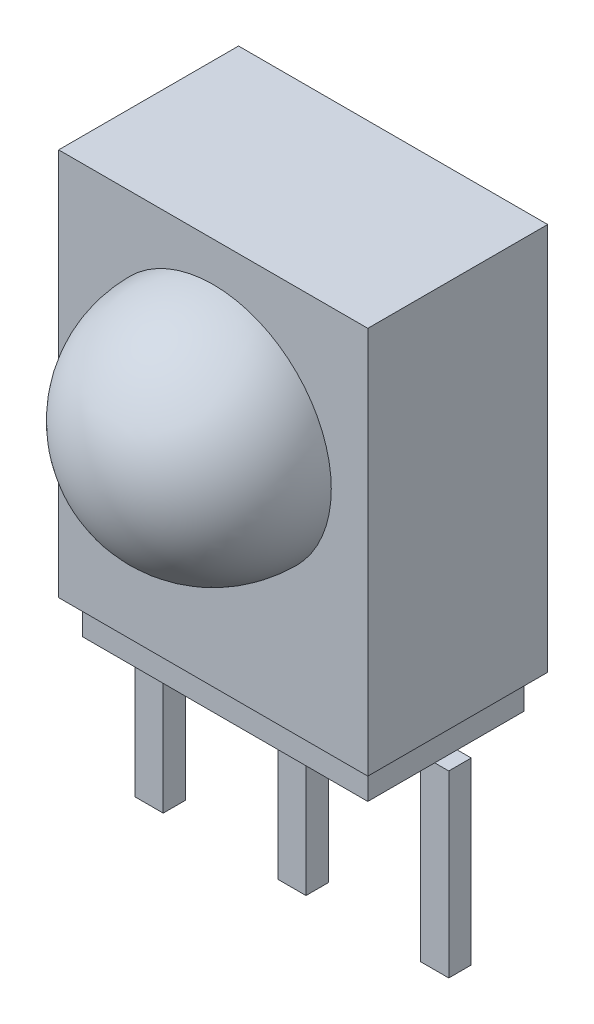
ISO-10303-21;
HEADER;
FILE_DESCRIPTION(('STEP AP214'),'2;1');
FILE_NAME('part.step','',(''),(''),'','','');
FILE_SCHEMA(('AUTOMOTIVE_DESIGN { 1 0 10303 214 1 1 1 1 }'));
ENDSEC;
DATA;
#1=APPLICATION_CONTEXT('core data for automotive mechanical design processes');
#2=APPLICATION_PROTOCOL_DEFINITION('international standard','automotive_design',2000,#1);
#3=PRODUCT_CONTEXT('',#1,'mechanical');
#4=PRODUCT('Part','Part','',(#3));
#5=PRODUCT_RELATED_PRODUCT_CATEGORY('part','',(#4));
#6=PRODUCT_DEFINITION_FORMATION('','',#4);
#7=PRODUCT_DEFINITION_CONTEXT('part definition',#1,'design');
#8=PRODUCT_DEFINITION('design','',#6,#7);
#9=PRODUCT_DEFINITION_SHAPE('','',#8);
#10=(LENGTH_UNIT() NAMED_UNIT(*) SI_UNIT(.MILLI.,.METRE.));
#11=(NAMED_UNIT(*) PLANE_ANGLE_UNIT() SI_UNIT($,.RADIAN.));
#12=(NAMED_UNIT(*) SI_UNIT($,.STERADIAN.) SOLID_ANGLE_UNIT());
#13=UNCERTAINTY_MEASURE_WITH_UNIT(LENGTH_MEASURE(1.E-05),#10,'distance_accuracy_value','');
#14=(GEOMETRIC_REPRESENTATION_CONTEXT(3) GLOBAL_UNCERTAINTY_ASSIGNED_CONTEXT((#13)) GLOBAL_UNIT_ASSIGNED_CONTEXT((#10,
#11,#12)) REPRESENTATION_CONTEXT('',''));
#15=CARTESIAN_POINT('',(0.,0.,0.));
#16=DIRECTION('',(0.,0.,1.));
#17=DIRECTION('',(1.,0.,0.));
#18=AXIS2_PLACEMENT_3D('',#15,#16,#17);
#19=CARTESIAN_POINT('',(0.21,-0.6,0.21));
#20=DIRECTION('',(0.,-1.,0.));
#21=DIRECTION('',(0.,0.,-1.));
#22=AXIS2_PLACEMENT_3D('',#19,#20,#21);
#23=PLANE('',#22);
#24=DIRECTION('',(1.,0.,0.));
#25=VECTOR('',#24,1.);
#26=CARTESIAN_POINT('',(3.,-0.6,1.4));
#27=LINE('',#26,#25);
#28=CARTESIAN_POINT('',(2.5,-0.6,1.4));
#29=VERTEX_POINT('',#28);
#30=CARTESIAN_POINT('',(3.,-0.6,1.4));
#31=VERTEX_POINT('',#30);
#32=EDGE_CURVE('E261',#29,#31,#27,.T.);
#33=ORIENTED_EDGE('',*,*,#32,.F.);
#34=DIRECTION('',(0.,0.,-1.));
#35=VECTOR('',#34,1.);
#36=CARTESIAN_POINT('',(2.5,-0.6,1.8));
#37=LINE('',#36,#35);
#38=CARTESIAN_POINT('',(2.5,-0.6,1.8));
#39=VERTEX_POINT('',#38);
#40=EDGE_CURVE('E247',#39,#29,#37,.T.);
#41=ORIENTED_EDGE('',*,*,#40,.F.);
#42=DIRECTION('',(-1.,0.,0.));
#43=VECTOR('',#42,1.);
#44=CARTESIAN_POINT('',(3.,-0.6,1.8));
#45=LINE('',#44,#43);
#46=CARTESIAN_POINT('',(3.,-0.6,1.8));
#47=VERTEX_POINT('',#46);
#48=EDGE_CURVE('E252',#47,#39,#45,.T.);
#49=ORIENTED_EDGE('',*,*,#48,.F.);
#50=DIRECTION('',(0.,0.,1.));
#51=VECTOR('',#50,1.);
#52=CARTESIAN_POINT('',(3.,-0.6,1.8));
#53=LINE('',#52,#51);
#54=EDGE_CURVE('E263',#31,#47,#53,.T.);
#55=ORIENTED_EDGE('',*,*,#54,.F.);
#56=EDGE_LOOP('',(#33,#41,#49,#55));
#57=FACE_BOUND('',#56,.T.);
#58=DIRECTION('',(0.,0.,1.));
#59=VECTOR('',#58,1.);
#60=CARTESIAN_POINT('',(0.459999999999999,-0.6,1.8));
#61=LINE('',#60,#59);
#62=CARTESIAN_POINT('',(0.459999999999999,-0.6,1.4));
#63=VERTEX_POINT('',#62);
#64=CARTESIAN_POINT('',(0.459999999999999,-0.6,1.8));
#65=VERTEX_POINT('',#64);
#66=EDGE_CURVE('E49',#63,#65,#61,.T.);
#67=ORIENTED_EDGE('',*,*,#66,.F.);
#68=DIRECTION('',(1.,0.,0.));
#69=VECTOR('',#68,1.);
#70=CARTESIAN_POINT('',(0.459999999999999,-0.6,1.4));
#71=LINE('',#70,#69);
#72=CARTESIAN_POINT('',(0.21,-0.6,1.4));
#73=VERTEX_POINT('',#72);
#74=EDGE_CURVE('E655',#73,#63,#71,.T.);
#75=ORIENTED_EDGE('',*,*,#74,.F.);
#76=DIRECTION('',(0.,0.,-1.));
#77=VECTOR('',#76,1.);
#78=CARTESIAN_POINT('',(0.21,-0.6,2.99));
#79=LINE('',#78,#77);
#80=CARTESIAN_POINT('',(0.21,-0.6,0.21));
#81=VERTEX_POINT('',#80);
#82=EDGE_CURVE('E281',#73,#81,#79,.T.);
#83=ORIENTED_EDGE('',*,*,#82,.T.);
#84=DIRECTION('',(1.,0.,0.));
#85=VECTOR('',#84,1.);
#86=CARTESIAN_POINT('',(0.21,-0.6,0.21));
#87=LINE('',#86,#85);
#88=CARTESIAN_POINT('',(5.29,-0.6,0.21));
#89=VERTEX_POINT('',#88);
#90=EDGE_CURVE('E279',#81,#89,#87,.T.);
#91=ORIENTED_EDGE('',*,*,#90,.T.);
#92=DIRECTION('',(0.,0.,1.));
#93=VECTOR('',#92,1.);
#94=CARTESIAN_POINT('',(5.29,-0.6,2.99));
#95=LINE('',#94,#93);
#96=CARTESIAN_POINT('',(5.29,-0.6,1.4));
#97=VERTEX_POINT('',#96);
#98=EDGE_CURVE('E284',#89,#97,#95,.T.);
#99=ORIENTED_EDGE('',*,*,#98,.T.);
#100=DIRECTION('',(1.,0.,0.));
#101=VECTOR('',#100,1.);
#102=CARTESIAN_POINT('',(5.54,-0.6,1.4));
#103=LINE('',#102,#101);
#104=CARTESIAN_POINT('',(5.04,-0.6,1.4));
#105=VERTEX_POINT('',#104);
#106=EDGE_CURVE('E228',#105,#97,#103,.T.);
#107=ORIENTED_EDGE('',*,*,#106,.F.);
#108=DIRECTION('',(0.,0.,-1.));
#109=VECTOR('',#108,1.);
#110=CARTESIAN_POINT('',(5.04,-0.6,1.8));
#111=LINE('',#110,#109);
#112=CARTESIAN_POINT('',(5.04,-0.6,1.8));
#113=VERTEX_POINT('',#112);
#114=EDGE_CURVE('E208',#113,#105,#111,.T.);
#115=ORIENTED_EDGE('',*,*,#114,.F.);
#116=DIRECTION('',(-1.,0.,0.));
#117=VECTOR('',#116,1.);
#118=CARTESIAN_POINT('',(5.54,-0.6,1.8));
#119=LINE('',#118,#117);
#120=CARTESIAN_POINT('',(5.29,-0.6,1.8));
#121=VERTEX_POINT('',#120);
#122=EDGE_CURVE('E233',#121,#113,#119,.T.);
#123=ORIENTED_EDGE('',*,*,#122,.F.);
#124=CARTESIAN_POINT('',(5.29,-0.6,2.99));
#125=VERTEX_POINT('',#124);
#126=EDGE_CURVE('E283',#121,#125,#95,.T.);
#127=ORIENTED_EDGE('',*,*,#126,.T.);
#128=DIRECTION('',(-1.,0.,0.));
#129=VECTOR('',#128,1.);
#130=CARTESIAN_POINT('',(0.21,-0.6,2.99));
#131=LINE('',#130,#129);
#132=CARTESIAN_POINT('',(0.21,-0.6,2.99));
#133=VERTEX_POINT('',#132);
#134=EDGE_CURVE('E287',#125,#133,#131,.T.);
#135=ORIENTED_EDGE('',*,*,#134,.T.);
#136=CARTESIAN_POINT('',(0.21,-0.6,1.8));
#137=VERTEX_POINT('',#136);
#138=EDGE_CURVE('E277',#133,#137,#79,.T.);
#139=ORIENTED_EDGE('',*,*,#138,.T.);
#140=DIRECTION('',(-1.,0.,0.));
#141=VECTOR('',#140,1.);
#142=CARTESIAN_POINT('',(0.459999999999999,-0.6,1.8));
#143=LINE('',#142,#141);
#144=EDGE_CURVE('E54',#65,#137,#143,.T.);
#145=ORIENTED_EDGE('',*,*,#144,.F.);
#146=EDGE_LOOP('',(#67,#75,#83,#91,#99,#107,#115,#123,#127,#135,#139,#145));
#147=FACE_BOUND('',#146,.T.);
#148=ADVANCED_FACE('F34',(#57,#147),#23,.T.);
#149=CARTESIAN_POINT('',(0.,0.,3.2));
#150=DIRECTION('',(0.,1.,0.));
#151=DIRECTION('',(0.,0.,1.));
#152=AXIS2_PLACEMENT_3D('',#149,#150,#151);
#153=PLANE('',#152);
#154=DIRECTION('',(1.,0.,0.));
#155=VECTOR('',#154,1.);
#156=CARTESIAN_POINT('',(0.,0.,0.));
#157=LINE('',#156,#155);
#158=CARTESIAN_POINT('',(0.,0.,0.));
#159=VERTEX_POINT('',#158);
#160=CARTESIAN_POINT('',(5.5,0.,0.));
#161=VERTEX_POINT('',#160);
#162=EDGE_CURVE('E327',#159,#161,#157,.T.);
#163=ORIENTED_EDGE('',*,*,#162,.T.);
#164=DIRECTION('',(0.,0.,-1.));
#165=VECTOR('',#164,1.);
#166=CARTESIAN_POINT('',(5.5,0.,3.2));
#167=LINE('',#166,#165);
#168=CARTESIAN_POINT('',(5.5,0.,3.2));
#169=VERTEX_POINT('',#168);
#170=EDGE_CURVE('E337',#169,#161,#167,.T.);
#171=ORIENTED_EDGE('',*,*,#170,.F.);
#172=DIRECTION('',(1.,0.,0.));
#173=VECTOR('',#172,1.);
#174=CARTESIAN_POINT('',(0.,0.,3.2));
#175=LINE('',#174,#173);
#176=CARTESIAN_POINT('',(0.,0.,3.2));
#177=VERTEX_POINT('',#176);
#178=EDGE_CURVE('E317',#177,#169,#175,.T.);
#179=ORIENTED_EDGE('',*,*,#178,.F.);
#180=DIRECTION('',(0.,0.,-1.));
#181=VECTOR('',#180,1.);
#182=CARTESIAN_POINT('',(0.,0.,3.2));
#183=LINE('',#182,#181);
#184=EDGE_CURVE('E42',#177,#159,#183,.T.);
#185=ORIENTED_EDGE('',*,*,#184,.T.);
#186=EDGE_LOOP('',(#163,#171,#179,#185));
#187=FACE_BOUND('',#186,.T.);
#188=DIRECTION('',(0.,0.,-1.));
#189=VECTOR('',#188,1.);
#190=CARTESIAN_POINT('',(0.21,0.,2.99));
#191=LINE('',#190,#189);
#192=CARTESIAN_POINT('',(0.21,0.,2.99));
#193=VERTEX_POINT('',#192);
#194=CARTESIAN_POINT('',(0.21,0.,0.21));
#195=VERTEX_POINT('',#194);
#196=EDGE_CURVE('E276',#193,#195,#191,.T.);
#197=ORIENTED_EDGE('',*,*,#196,.F.);
#198=DIRECTION('',(-1.,0.,0.));
#199=VECTOR('',#198,1.);
#200=CARTESIAN_POINT('',(0.21,0.,2.99));
#201=LINE('',#200,#199);
#202=CARTESIAN_POINT('',(5.29,0.,2.99));
#203=VERTEX_POINT('',#202);
#204=EDGE_CURVE('E299',#203,#193,#201,.T.);
#205=ORIENTED_EDGE('',*,*,#204,.F.);
#206=DIRECTION('',(0.,0.,1.));
#207=VECTOR('',#206,1.);
#208=CARTESIAN_POINT('',(5.29,0.,2.99));
#209=LINE('',#208,#207);
#210=CARTESIAN_POINT('',(5.29,0.,0.21));
#211=VERTEX_POINT('',#210);
#212=EDGE_CURVE('E296',#211,#203,#209,.T.);
#213=ORIENTED_EDGE('',*,*,#212,.F.);
#214=DIRECTION('',(1.,0.,0.));
#215=VECTOR('',#214,1.);
#216=CARTESIAN_POINT('',(0.21,0.,0.21));
#217=LINE('',#216,#215);
#218=EDGE_CURVE('E293',#195,#211,#217,.T.);
#219=ORIENTED_EDGE('',*,*,#218,.F.);
#220=EDGE_LOOP('',(#197,#205,#213,#219));
#221=FACE_BOUND('',#220,.T.);
#222=ADVANCED_FACE('F342',(#187,#221),#153,.F.);
#223=CARTESIAN_POINT('',(0.,6.9,3.2));
#224=DIRECTION('',(0.,0.,-1.));
#225=DIRECTION('',(-1.,0.,0.));
#226=AXIS2_PLACEMENT_3D('',#223,#224,#225);
#227=PLANE('',#226);
#228=DIRECTION('',(0.,-1.,0.));
#229=VECTOR('',#228,1.);
#230=CARTESIAN_POINT('',(0.,0.,3.2));
#231=LINE('',#230,#229);
#232=CARTESIAN_POINT('',(0.,6.9,3.2));
#233=VERTEX_POINT('',#232);
#234=EDGE_CURVE('E314',#233,#177,#231,.T.);
#235=ORIENTED_EDGE('',*,*,#234,.T.);
#236=ORIENTED_EDGE('',*,*,#178,.T.);
#237=DIRECTION('',(0.,1.,0.));
#238=VECTOR('',#237,1.);
#239=CARTESIAN_POINT('',(5.5,0.,3.2));
#240=LINE('',#239,#238);
#241=CARTESIAN_POINT('',(5.5,6.9,3.2));
#242=VERTEX_POINT('',#241);
#243=EDGE_CURVE('E320',#169,#242,#240,.T.);
#244=ORIENTED_EDGE('',*,*,#243,.T.);
#245=DIRECTION('',(-1.,0.,0.));
#246=VECTOR('',#245,1.);
#247=CARTESIAN_POINT('',(0.,6.9,3.2));
#248=LINE('',#247,#246);
#249=EDGE_CURVE('E322',#242,#233,#248,.T.);
#250=ORIENTED_EDGE('',*,*,#249,.T.);
#251=EDGE_LOOP('',(#235,#236,#244,#250));
#252=FACE_BOUND('',#251,.T.);
#253=CARTESIAN_POINT('',(2.75,4.1,3.2));
#254=DIRECTION('',(0.,0.,-1.));
#255=DIRECTION('',(-1.,0.,0.));
#256=AXIS2_PLACEMENT_3D('',#253,#254,#255);
#257=CIRCLE('',#256,2.1);
#258=CARTESIAN_POINT('',(0.65,4.1,3.2));
#259=VERTEX_POINT('',#258);
#260=EDGE_CURVE('E11',#259,#259,#257,.F.);
#261=ORIENTED_EDGE('',*,*,#260,.F.);
#262=EDGE_LOOP('',(#261));
#263=FACE_BOUND('',#262,.T.);
#264=ADVANCED_FACE('F362',(#252,#263),#227,.F.);
#265=CARTESIAN_POINT('',(0.,0.,3.2));
#266=DIRECTION('',(1.,0.,0.));
#267=DIRECTION('',(0.,0.,-1.));
#268=AXIS2_PLACEMENT_3D('',#265,#266,#267);
#269=PLANE('',#268);
#270=DIRECTION('',(0.,-1.,0.));
#271=VECTOR('',#270,1.);
#272=CARTESIAN_POINT('',(0.,0.,0.));
#273=LINE('',#272,#271);
#274=CARTESIAN_POINT('',(0.,6.9,0.));
#275=VERTEX_POINT('',#274);
#276=EDGE_CURVE('E313',#275,#159,#273,.T.);
#277=ORIENTED_EDGE('',*,*,#276,.T.);
#278=ORIENTED_EDGE('',*,*,#184,.F.);
#279=ORIENTED_EDGE('',*,*,#234,.F.);
#280=DIRECTION('',(0.,0.,-1.));
#281=VECTOR('',#280,1.);
#282=CARTESIAN_POINT('',(0.,6.9,3.2));
#283=LINE('',#282,#281);
#284=EDGE_CURVE('E324',#233,#275,#283,.T.);
#285=ORIENTED_EDGE('',*,*,#284,.T.);
#286=EDGE_LOOP('',(#277,#278,#279,#285));
#287=FACE_BOUND('',#286,.T.);
#288=ADVANCED_FACE('F348',(#287),#269,.F.);
#289=CARTESIAN_POINT('',(5.5,0.,3.2));
#290=DIRECTION('',(-1.,0.,0.));
#291=DIRECTION('',(0.,-1.,0.));
#292=AXIS2_PLACEMENT_3D('',#289,#290,#291);
#293=PLANE('',#292);
#294=DIRECTION('',(0.,1.,0.));
#295=VECTOR('',#294,1.);
#296=CARTESIAN_POINT('',(5.5,0.,0.));
#297=LINE('',#296,#295);
#298=CARTESIAN_POINT('',(5.5,6.9,0.));
#299=VERTEX_POINT('',#298);
#300=EDGE_CURVE('E329',#161,#299,#297,.T.);
#301=ORIENTED_EDGE('',*,*,#300,.T.);
#302=DIRECTION('',(0.,0.,-1.));
#303=VECTOR('',#302,1.);
#304=CARTESIAN_POINT('',(5.5,6.9,3.2));
#305=LINE('',#304,#303);
#306=EDGE_CURVE('E334',#242,#299,#305,.T.);
#307=ORIENTED_EDGE('',*,*,#306,.F.);
#308=ORIENTED_EDGE('',*,*,#243,.F.);
#309=ORIENTED_EDGE('',*,*,#170,.T.);
#310=EDGE_LOOP('',(#301,#307,#308,#309));
#311=FACE_BOUND('',#310,.T.);
#312=ADVANCED_FACE('F356',(#311),#293,.F.);
#313=CARTESIAN_POINT('',(0.,6.9,3.2));
#314=DIRECTION('',(0.,-1.,0.));
#315=DIRECTION('',(0.,0.,-1.));
#316=AXIS2_PLACEMENT_3D('',#313,#314,#315);
#317=PLANE('',#316);
#318=DIRECTION('',(-1.,0.,0.));
#319=VECTOR('',#318,1.);
#320=CARTESIAN_POINT('',(0.,6.9,0.));
#321=LINE('',#320,#319);
#322=EDGE_CURVE('E318',#299,#275,#321,.T.);
#323=ORIENTED_EDGE('',*,*,#322,.T.);
#324=ORIENTED_EDGE('',*,*,#284,.F.);
#325=ORIENTED_EDGE('',*,*,#249,.F.);
#326=ORIENTED_EDGE('',*,*,#306,.T.);
#327=EDGE_LOOP('',(#323,#324,#325,#326));
#328=FACE_BOUND('',#327,.T.);
#329=ADVANCED_FACE('F360',(#328),#317,.F.);
#330=CARTESIAN_POINT('',(0.,6.9,0.));
#331=DIRECTION('',(0.,0.,-1.));
#332=DIRECTION('',(-1.,0.,0.));
#333=AXIS2_PLACEMENT_3D('',#330,#331,#332);
#334=PLANE('',#333);
#335=ORIENTED_EDGE('',*,*,#276,.F.);
#336=ORIENTED_EDGE('',*,*,#322,.F.);
#337=ORIENTED_EDGE('',*,*,#300,.F.);
#338=ORIENTED_EDGE('',*,*,#162,.F.);
#339=EDGE_LOOP('',(#335,#336,#337,#338));
#340=FACE_BOUND('',#339,.T.);
#341=ADVANCED_FACE('F352',(#340),#334,.T.);
#342=CARTESIAN_POINT('',(2.75,4.1,3.2));
#343=DIRECTION('',(0.,0.,1.));
#344=DIRECTION('',(1.,0.,0.));
#345=AXIS2_PLACEMENT_3D('',#342,#343,#344);
#346=SPHERICAL_SURFACE('',#345,2.1);
#347=ORIENTED_EDGE('',*,*,#260,.T.);
#348=EDGE_LOOP('',(#347));
#349=FACE_BOUND('',#348,.T.);
#350=ADVANCED_FACE('F36',(#349),#346,.T.);
#351=CARTESIAN_POINT('',(0.21,-0.6,2.99));
#352=DIRECTION('',(1.,0.,0.));
#353=DIRECTION('',(0.,0.,-1.));
#354=AXIS2_PLACEMENT_3D('',#351,#352,#353);
#355=PLANE('',#354);
#356=ORIENTED_EDGE('',*,*,#196,.T.);
#357=DIRECTION('',(0.,1.,0.));
#358=VECTOR('',#357,1.);
#359=CARTESIAN_POINT('',(0.21,-0.6,0.21));
#360=LINE('',#359,#358);
#361=EDGE_CURVE('E310',#81,#195,#360,.T.);
#362=ORIENTED_EDGE('',*,*,#361,.F.);
#363=ORIENTED_EDGE('',*,*,#82,.F.);
#364=EDGE_CURVE('E280',#137,#73,#79,.T.);
#365=ORIENTED_EDGE('',*,*,#364,.F.);
#366=ORIENTED_EDGE('',*,*,#138,.F.);
#367=DIRECTION('',(0.,1.,0.));
#368=VECTOR('',#367,1.);
#369=CARTESIAN_POINT('',(0.21,-0.6,2.99));
#370=LINE('',#369,#368);
#371=EDGE_CURVE('E290',#133,#193,#370,.T.);
#372=ORIENTED_EDGE('',*,*,#371,.T.);
#373=EDGE_LOOP('',(#356,#362,#363,#365,#366,#372));
#374=FACE_BOUND('',#373,.T.);
#375=ADVANCED_FACE('F369',(#374),#355,.F.);
#376=CARTESIAN_POINT('',(0.21,-0.6,0.21));
#377=DIRECTION('',(0.,0.,1.));
#378=DIRECTION('',(1.,0.,0.));
#379=AXIS2_PLACEMENT_3D('',#376,#377,#378);
#380=PLANE('',#379);
#381=ORIENTED_EDGE('',*,*,#218,.T.);
#382=DIRECTION('',(0.,1.,0.));
#383=VECTOR('',#382,1.);
#384=CARTESIAN_POINT('',(5.29,-0.6,0.21));
#385=LINE('',#384,#383);
#386=EDGE_CURVE('E307',#89,#211,#385,.T.);
#387=ORIENTED_EDGE('',*,*,#386,.F.);
#388=ORIENTED_EDGE('',*,*,#90,.F.);
#389=ORIENTED_EDGE('',*,*,#361,.T.);
#390=EDGE_LOOP('',(#381,#387,#388,#389));
#391=FACE_BOUND('',#390,.T.);
#392=ADVANCED_FACE('F374',(#391),#380,.F.);
#393=CARTESIAN_POINT('',(5.29,-0.6,2.99));
#394=DIRECTION('',(-1.,0.,0.));
#395=DIRECTION('',(0.,0.,1.));
#396=AXIS2_PLACEMENT_3D('',#393,#394,#395);
#397=PLANE('',#396);
#398=ORIENTED_EDGE('',*,*,#212,.T.);
#399=DIRECTION('',(0.,1.,0.));
#400=VECTOR('',#399,1.);
#401=CARTESIAN_POINT('',(5.29,-0.6,2.99));
#402=LINE('',#401,#400);
#403=EDGE_CURVE('E304',#125,#203,#402,.T.);
#404=ORIENTED_EDGE('',*,*,#403,.F.);
#405=ORIENTED_EDGE('',*,*,#126,.F.);
#406=EDGE_CURVE('E288',#97,#121,#95,.T.);
#407=ORIENTED_EDGE('',*,*,#406,.F.);
#408=ORIENTED_EDGE('',*,*,#98,.F.);
#409=ORIENTED_EDGE('',*,*,#386,.T.);
#410=EDGE_LOOP('',(#398,#404,#405,#407,#408,#409));
#411=FACE_BOUND('',#410,.T.);
#412=ADVANCED_FACE('F393',(#411),#397,.F.);
#413=CARTESIAN_POINT('',(0.21,-0.6,2.99));
#414=DIRECTION('',(0.,0.,-1.));
#415=DIRECTION('',(-1.,0.,0.));
#416=AXIS2_PLACEMENT_3D('',#413,#414,#415);
#417=PLANE('',#416);
#418=ORIENTED_EDGE('',*,*,#204,.T.);
#419=ORIENTED_EDGE('',*,*,#371,.F.);
#420=ORIENTED_EDGE('',*,*,#134,.F.);
#421=ORIENTED_EDGE('',*,*,#403,.T.);
#422=EDGE_LOOP('',(#418,#419,#420,#421));
#423=FACE_BOUND('',#422,.T.);
#424=ADVANCED_FACE('F390',(#423),#417,.F.);
#425=CARTESIAN_POINT('',(2.5,-3.79,1.8));
#426=DIRECTION('',(1.,0.,0.));
#427=DIRECTION('',(0.,0.,-1.));
#428=AXIS2_PLACEMENT_3D('',#425,#426,#427);
#429=PLANE('',#428);
#430=ORIENTED_EDGE('',*,*,#40,.T.);
#431=DIRECTION('',(0.,1.,0.));
#432=VECTOR('',#431,1.);
#433=CARTESIAN_POINT('',(2.5,-3.79,1.4));
#434=LINE('',#433,#432);
#435=CARTESIAN_POINT('',(2.5,-3.79,1.4));
#436=VERTEX_POINT('',#435);
#437=EDGE_CURVE('E274',#436,#29,#434,.T.);
#438=ORIENTED_EDGE('',*,*,#437,.F.);
#439=DIRECTION('',(0.,0.,-1.));
#440=VECTOR('',#439,1.);
#441=CARTESIAN_POINT('',(2.5,-3.79,1.8));
#442=LINE('',#441,#440);
#443=CARTESIAN_POINT('',(2.5,-3.79,1.8));
#444=VERTEX_POINT('',#443);
#445=EDGE_CURVE('E248',#444,#436,#442,.T.);
#446=ORIENTED_EDGE('',*,*,#445,.F.);
#447=DIRECTION('',(0.,1.,0.));
#448=VECTOR('',#447,1.);
#449=CARTESIAN_POINT('',(2.5,-3.79,1.8));
#450=LINE('',#449,#448);
#451=EDGE_CURVE('E258',#444,#39,#450,.T.);
#452=ORIENTED_EDGE('',*,*,#451,.T.);
#453=EDGE_LOOP('',(#430,#438,#446,#452));
#454=FACE_BOUND('',#453,.T.);
#455=ADVANCED_FACE('F388',(#454),#429,.F.);
#456=CARTESIAN_POINT('',(3.,-3.79,1.4));
#457=DIRECTION('',(0.,0.,1.));
#458=DIRECTION('',(1.,0.,0.));
#459=AXIS2_PLACEMENT_3D('',#456,#457,#458);
#460=PLANE('',#459);
#461=ORIENTED_EDGE('',*,*,#32,.T.);
#462=DIRECTION('',(0.,1.,0.));
#463=VECTOR('',#462,1.);
#464=CARTESIAN_POINT('',(3.,-3.79,1.4));
#465=LINE('',#464,#463);
#466=CARTESIAN_POINT('',(3.,-3.79,1.4));
#467=VERTEX_POINT('',#466);
#468=EDGE_CURVE('E271',#467,#31,#465,.T.);
#469=ORIENTED_EDGE('',*,*,#468,.F.);
#470=DIRECTION('',(1.,0.,0.));
#471=VECTOR('',#470,1.);
#472=CARTESIAN_POINT('',(3.,-3.79,1.4));
#473=LINE('',#472,#471);
#474=EDGE_CURVE('E251',#436,#467,#473,.T.);
#475=ORIENTED_EDGE('',*,*,#474,.F.);
#476=ORIENTED_EDGE('',*,*,#437,.T.);
#477=EDGE_LOOP('',(#461,#469,#475,#476));
#478=FACE_BOUND('',#477,.T.);
#479=ADVANCED_FACE('F458',(#478),#460,.F.);
#480=CARTESIAN_POINT('',(3.,-3.79,1.8));
#481=DIRECTION('',(-1.,0.,0.));
#482=DIRECTION('',(0.,0.,1.));
#483=AXIS2_PLACEMENT_3D('',#480,#481,#482);
#484=PLANE('',#483);
#485=ORIENTED_EDGE('',*,*,#54,.T.);
#486=DIRECTION('',(0.,1.,0.));
#487=VECTOR('',#486,1.);
#488=CARTESIAN_POINT('',(3.,-3.79,1.8));
#489=LINE('',#488,#487);
#490=CARTESIAN_POINT('',(3.,-3.79,1.8));
#491=VERTEX_POINT('',#490);
#492=EDGE_CURVE('E269',#491,#47,#489,.T.);
#493=ORIENTED_EDGE('',*,*,#492,.F.);
#494=DIRECTION('',(0.,0.,1.));
#495=VECTOR('',#494,1.);
#496=CARTESIAN_POINT('',(3.,-3.79,1.8));
#497=LINE('',#496,#495);
#498=EDGE_CURVE('E254',#467,#491,#497,.T.);
#499=ORIENTED_EDGE('',*,*,#498,.F.);
#500=ORIENTED_EDGE('',*,*,#468,.T.);
#501=EDGE_LOOP('',(#485,#493,#499,#500));
#502=FACE_BOUND('',#501,.T.);
#503=ADVANCED_FACE('F467',(#502),#484,.F.);
#504=CARTESIAN_POINT('',(3.,-3.79,1.8));
#505=DIRECTION('',(0.,0.,-1.));
#506=DIRECTION('',(-1.,0.,0.));
#507=AXIS2_PLACEMENT_3D('',#504,#505,#506);
#508=PLANE('',#507);
#509=ORIENTED_EDGE('',*,*,#48,.T.);
#510=ORIENTED_EDGE('',*,*,#451,.F.);
#511=DIRECTION('',(-1.,0.,0.));
#512=VECTOR('',#511,1.);
#513=CARTESIAN_POINT('',(3.,-3.79,1.8));
#514=LINE('',#513,#512);
#515=EDGE_CURVE('E256',#491,#444,#514,.T.);
#516=ORIENTED_EDGE('',*,*,#515,.F.);
#517=ORIENTED_EDGE('',*,*,#492,.T.);
#518=EDGE_LOOP('',(#509,#510,#516,#517));
#519=FACE_BOUND('',#518,.T.);
#520=ADVANCED_FACE('F476',(#519),#508,.F.);
#521=CARTESIAN_POINT('',(2.5,-3.79,1.4));
#522=DIRECTION('',(0.,1.,0.));
#523=DIRECTION('',(0.,0.,1.));
#524=AXIS2_PLACEMENT_3D('',#521,#522,#523);
#525=PLANE('',#524);
#526=ORIENTED_EDGE('',*,*,#445,.T.);
#527=ORIENTED_EDGE('',*,*,#474,.T.);
#528=ORIENTED_EDGE('',*,*,#498,.T.);
#529=ORIENTED_EDGE('',*,*,#515,.T.);
#530=EDGE_LOOP('',(#526,#527,#528,#529));
#531=FACE_BOUND('',#530,.T.);
#532=ADVANCED_FACE('F486',(#531),#525,.F.);
#533=CARTESIAN_POINT('',(5.04,-0.6,1.4));
#534=DIRECTION('',(0.,1.,0.));
#535=DIRECTION('',(0.,0.,1.));
#536=AXIS2_PLACEMENT_3D('',#533,#534,#535);
#537=PLANE('',#536);
#538=ORIENTED_EDGE('',*,*,#406,.T.);
#539=CARTESIAN_POINT('',(5.54,-0.6,1.8));
#540=VERTEX_POINT('',#539);
#541=EDGE_CURVE('E221',#540,#121,#119,.T.);
#542=ORIENTED_EDGE('',*,*,#541,.F.);
#543=DIRECTION('',(0.,0.,1.));
#544=VECTOR('',#543,1.);
#545=CARTESIAN_POINT('',(5.54,-0.6,1.8));
#546=LINE('',#545,#544);
#547=CARTESIAN_POINT('',(5.54,-0.6,1.4));
#548=VERTEX_POINT('',#547);
#549=EDGE_CURVE('E231',#548,#540,#546,.T.);
#550=ORIENTED_EDGE('',*,*,#549,.F.);
#551=EDGE_CURVE('E211',#97,#548,#103,.T.);
#552=ORIENTED_EDGE('',*,*,#551,.F.);
#553=EDGE_LOOP('',(#538,#542,#550,#552));
#554=FACE_BOUND('',#553,.T.);
#555=ADVANCED_FACE('F495',(#554),#537,.T.);
#556=CARTESIAN_POINT('',(5.04,-3.79,1.8));
#557=DIRECTION('',(1.,0.,0.));
#558=DIRECTION('',(0.,0.,-1.));
#559=AXIS2_PLACEMENT_3D('',#556,#557,#558);
#560=PLANE('',#559);
#561=ORIENTED_EDGE('',*,*,#114,.T.);
#562=DIRECTION('',(0.,1.,0.));
#563=VECTOR('',#562,1.);
#564=CARTESIAN_POINT('',(5.04,-3.79,1.4));
#565=LINE('',#564,#563);
#566=CARTESIAN_POINT('',(5.04,-3.79,1.4));
#567=VERTEX_POINT('',#566);
#568=EDGE_CURVE('E244',#567,#105,#565,.T.);
#569=ORIENTED_EDGE('',*,*,#568,.F.);
#570=DIRECTION('',(0.,0.,-1.));
#571=VECTOR('',#570,1.);
#572=CARTESIAN_POINT('',(5.04,-3.79,1.8));
#573=LINE('',#572,#571);
#574=CARTESIAN_POINT('',(5.04,-3.79,1.8));
#575=VERTEX_POINT('',#574);
#576=EDGE_CURVE('E217',#575,#567,#573,.T.);
#577=ORIENTED_EDGE('',*,*,#576,.F.);
#578=DIRECTION('',(0.,1.,0.));
#579=VECTOR('',#578,1.);
#580=CARTESIAN_POINT('',(5.04,-3.79,1.8));
#581=LINE('',#580,#579);
#582=EDGE_CURVE('E226',#575,#113,#581,.T.);
#583=ORIENTED_EDGE('',*,*,#582,.T.);
#584=EDGE_LOOP('',(#561,#569,#577,#583));
#585=FACE_BOUND('',#584,.T.);
#586=ADVANCED_FACE('F520',(#585),#560,.F.);
#587=CARTESIAN_POINT('',(5.54,-3.79,1.4));
#588=DIRECTION('',(0.,0.,1.));
#589=DIRECTION('',(1.,0.,0.));
#590=AXIS2_PLACEMENT_3D('',#587,#588,#589);
#591=PLANE('',#590);
#592=ORIENTED_EDGE('',*,*,#106,.T.);
#593=ORIENTED_EDGE('',*,*,#551,.T.);
#594=DIRECTION('',(0.,1.,0.));
#595=VECTOR('',#594,1.);
#596=CARTESIAN_POINT('',(5.54,-3.79,1.4));
#597=LINE('',#596,#595);
#598=CARTESIAN_POINT('',(5.54,-3.79,1.4));
#599=VERTEX_POINT('',#598);
#600=EDGE_CURVE('E241',#599,#548,#597,.T.);
#601=ORIENTED_EDGE('',*,*,#600,.F.);
#602=DIRECTION('',(1.,0.,0.));
#603=VECTOR('',#602,1.);
#604=CARTESIAN_POINT('',(5.54,-3.79,1.4));
#605=LINE('',#604,#603);
#606=EDGE_CURVE('E220',#567,#599,#605,.T.);
#607=ORIENTED_EDGE('',*,*,#606,.F.);
#608=ORIENTED_EDGE('',*,*,#568,.T.);
#609=EDGE_LOOP('',(#592,#593,#601,#607,#608));
#610=FACE_BOUND('',#609,.T.);
#611=ADVANCED_FACE('F531',(#610),#591,.F.);
#612=CARTESIAN_POINT('',(5.54,-3.79,1.8));
#613=DIRECTION('',(-1.,0.,0.));
#614=DIRECTION('',(0.,0.,1.));
#615=AXIS2_PLACEMENT_3D('',#612,#613,#614);
#616=PLANE('',#615);
#617=ORIENTED_EDGE('',*,*,#549,.T.);
#618=DIRECTION('',(0.,1.,0.));
#619=VECTOR('',#618,1.);
#620=CARTESIAN_POINT('',(5.54,-3.79,1.8));
#621=LINE('',#620,#619);
#622=CARTESIAN_POINT('',(5.54,-3.79,1.8));
#623=VERTEX_POINT('',#622);
#624=EDGE_CURVE('E238',#623,#540,#621,.T.);
#625=ORIENTED_EDGE('',*,*,#624,.F.);
#626=DIRECTION('',(0.,0.,1.));
#627=VECTOR('',#626,1.);
#628=CARTESIAN_POINT('',(5.54,-3.79,1.8));
#629=LINE('',#628,#627);
#630=EDGE_CURVE('E223',#599,#623,#629,.T.);
#631=ORIENTED_EDGE('',*,*,#630,.F.);
#632=ORIENTED_EDGE('',*,*,#600,.T.);
#633=EDGE_LOOP('',(#617,#625,#631,#632));
#634=FACE_BOUND('',#633,.T.);
#635=ADVANCED_FACE('F544',(#634),#616,.F.);
#636=CARTESIAN_POINT('',(5.54,-3.79,1.8));
#637=DIRECTION('',(0.,0.,-1.));
#638=DIRECTION('',(-1.,0.,0.));
#639=AXIS2_PLACEMENT_3D('',#636,#637,#638);
#640=PLANE('',#639);
#641=ORIENTED_EDGE('',*,*,#541,.T.);
#642=ORIENTED_EDGE('',*,*,#122,.T.);
#643=ORIENTED_EDGE('',*,*,#582,.F.);
#644=DIRECTION('',(-1.,0.,0.));
#645=VECTOR('',#644,1.);
#646=CARTESIAN_POINT('',(5.54,-3.79,1.8));
#647=LINE('',#646,#645);
#648=EDGE_CURVE('E225',#623,#575,#647,.T.);
#649=ORIENTED_EDGE('',*,*,#648,.F.);
#650=ORIENTED_EDGE('',*,*,#624,.T.);
#651=EDGE_LOOP('',(#641,#642,#643,#649,#650));
#652=FACE_BOUND('',#651,.T.);
#653=ADVANCED_FACE('F556',(#652),#640,.F.);
#654=CARTESIAN_POINT('',(5.04,-3.79,1.4));
#655=DIRECTION('',(0.,1.,0.));
#656=DIRECTION('',(0.,0.,1.));
#657=AXIS2_PLACEMENT_3D('',#654,#655,#656);
#658=PLANE('',#657);
#659=ORIENTED_EDGE('',*,*,#576,.T.);
#660=ORIENTED_EDGE('',*,*,#606,.T.);
#661=ORIENTED_EDGE('',*,*,#630,.T.);
#662=ORIENTED_EDGE('',*,*,#648,.T.);
#663=EDGE_LOOP('',(#659,#660,#661,#662));
#664=FACE_BOUND('',#663,.T.);
#665=ADVANCED_FACE('F568',(#664),#658,.F.);
#666=CARTESIAN_POINT('',(-0.0400000000000005,-0.6,1.4));
#667=DIRECTION('',(0.,1.,0.));
#668=DIRECTION('',(0.,0.,1.));
#669=AXIS2_PLACEMENT_3D('',#666,#667,#668);
#670=PLANE('',#669);
#671=ORIENTED_EDGE('',*,*,#364,.T.);
#672=CARTESIAN_POINT('',(-0.0400000000000005,-0.6,1.4));
#673=VERTEX_POINT('',#672);
#674=EDGE_CURVE('E656',#673,#73,#71,.T.);
#675=ORIENTED_EDGE('',*,*,#674,.F.);
#676=DIRECTION('',(0.,0.,-1.));
#677=VECTOR('',#676,1.);
#678=CARTESIAN_POINT('',(-0.0400000000000005,-0.6,1.8));
#679=LINE('',#678,#677);
#680=CARTESIAN_POINT('',(-0.0400000000000005,-0.6,1.8));
#681=VERTEX_POINT('',#680);
#682=EDGE_CURVE('E207',#681,#673,#679,.T.);
#683=ORIENTED_EDGE('',*,*,#682,.F.);
#684=EDGE_CURVE('E645',#137,#681,#143,.T.);
#685=ORIENTED_EDGE('',*,*,#684,.F.);
#686=EDGE_LOOP('',(#671,#675,#683,#685));
#687=FACE_BOUND('',#686,.T.);
#688=ADVANCED_FACE('F579',(#687),#670,.T.);
#689=CARTESIAN_POINT('',(-0.0400000000000005,-3.79,1.8));
#690=DIRECTION('',(1.,0.,0.));
#691=DIRECTION('',(0.,0.,-1.));
#692=AXIS2_PLACEMENT_3D('',#689,#690,#691);
#693=PLANE('',#692);
#694=ORIENTED_EDGE('',*,*,#682,.T.);
#695=DIRECTION('',(0.,1.,0.));
#696=VECTOR('',#695,1.);
#697=CARTESIAN_POINT('',(-0.0400000000000005,-3.79,1.4));
#698=LINE('',#697,#696);
#699=CARTESIAN_POINT('',(-0.0400000000000005,-3.79,1.4));
#700=VERTEX_POINT('',#699);
#701=EDGE_CURVE('E188',#700,#673,#698,.T.);
#702=ORIENTED_EDGE('',*,*,#701,.F.);
#703=DIRECTION('',(0.,0.,-1.));
#704=VECTOR('',#703,1.);
#705=CARTESIAN_POINT('',(-0.0400000000000005,-3.79,1.8));
#706=LINE('',#705,#704);
#707=CARTESIAN_POINT('',(-0.0400000000000005,-3.79,1.8));
#708=VERTEX_POINT('',#707);
#709=EDGE_CURVE('E195',#708,#700,#706,.T.);
#710=ORIENTED_EDGE('',*,*,#709,.F.);
#711=DIRECTION('',(0.,1.,0.));
#712=VECTOR('',#711,1.);
#713=CARTESIAN_POINT('',(-0.0400000000000005,-3.79,1.8));
#714=LINE('',#713,#712);
#715=EDGE_CURVE('E651',#708,#681,#714,.T.);
#716=ORIENTED_EDGE('',*,*,#715,.T.);
#717=EDGE_LOOP('',(#694,#702,#710,#716));
#718=FACE_BOUND('',#717,.T.);
#719=ADVANCED_FACE('F205',(#718),#693,.F.);
#720=CARTESIAN_POINT('',(0.459999999999999,-3.79,1.4));
#721=DIRECTION('',(0.,0.,1.));
#722=DIRECTION('',(1.,0.,0.));
#723=AXIS2_PLACEMENT_3D('',#720,#721,#722);
#724=PLANE('',#723);
#725=ORIENTED_EDGE('',*,*,#674,.T.);
#726=ORIENTED_EDGE('',*,*,#74,.T.);
#727=DIRECTION('',(0.,1.,0.));
#728=VECTOR('',#727,1.);
#729=CARTESIAN_POINT('',(0.459999999999999,-3.79,1.4));
#730=LINE('',#729,#728);
#731=CARTESIAN_POINT('',(0.459999999999999,-3.79,1.4));
#732=VERTEX_POINT('',#731);
#733=EDGE_CURVE('E191',#732,#63,#730,.T.);
#734=ORIENTED_EDGE('',*,*,#733,.F.);
#735=DIRECTION('',(1.,0.,0.));
#736=VECTOR('',#735,1.);
#737=CARTESIAN_POINT('',(0.459999999999999,-3.79,1.4));
#738=LINE('',#737,#736);
#739=EDGE_CURVE('E183',#700,#732,#738,.T.);
#740=ORIENTED_EDGE('',*,*,#739,.F.);
#741=ORIENTED_EDGE('',*,*,#701,.T.);
#742=EDGE_LOOP('',(#725,#726,#734,#740,#741));
#743=FACE_BOUND('',#742,.T.);
#744=ADVANCED_FACE('F186',(#743),#724,.F.);
#745=CARTESIAN_POINT('',(0.459999999999999,-3.79,1.8));
#746=DIRECTION('',(-1.,0.,0.));
#747=DIRECTION('',(0.,0.,1.));
#748=AXIS2_PLACEMENT_3D('',#745,#746,#747);
#749=PLANE('',#748);
#750=ORIENTED_EDGE('',*,*,#66,.T.);
#751=DIRECTION('',(0.,1.,0.));
#752=VECTOR('',#751,1.);
#753=CARTESIAN_POINT('',(0.459999999999999,-3.79,1.8));
#754=LINE('',#753,#752);
#755=CARTESIAN_POINT('',(0.459999999999999,-3.79,1.8));
#756=VERTEX_POINT('',#755);
#757=EDGE_CURVE('E213',#756,#65,#754,.T.);
#758=ORIENTED_EDGE('',*,*,#757,.F.);
#759=DIRECTION('',(0.,0.,1.));
#760=VECTOR('',#759,1.);
#761=CARTESIAN_POINT('',(0.459999999999999,-3.79,1.8));
#762=LINE('',#761,#760);
#763=EDGE_CURVE('E194',#732,#756,#762,.T.);
#764=ORIENTED_EDGE('',*,*,#763,.F.);
#765=ORIENTED_EDGE('',*,*,#733,.T.);
#766=EDGE_LOOP('',(#750,#758,#764,#765));
#767=FACE_BOUND('',#766,.T.);
#768=ADVANCED_FACE('F607',(#767),#749,.F.);
#769=CARTESIAN_POINT('',(0.459999999999999,-3.79,1.8));
#770=DIRECTION('',(0.,0.,-1.));
#771=DIRECTION('',(-1.,0.,0.));
#772=AXIS2_PLACEMENT_3D('',#769,#770,#771);
#773=PLANE('',#772);
#774=ORIENTED_EDGE('',*,*,#144,.T.);
#775=ORIENTED_EDGE('',*,*,#684,.T.);
#776=ORIENTED_EDGE('',*,*,#715,.F.);
#777=DIRECTION('',(-1.,0.,0.));
#778=VECTOR('',#777,1.);
#779=CARTESIAN_POINT('',(0.459999999999999,-3.79,1.8));
#780=LINE('',#779,#778);
#781=EDGE_CURVE('E200',#756,#708,#780,.T.);
#782=ORIENTED_EDGE('',*,*,#781,.F.);
#783=ORIENTED_EDGE('',*,*,#757,.T.);
#784=EDGE_LOOP('',(#774,#775,#776,#782,#783));
#785=FACE_BOUND('',#784,.T.);
#786=ADVANCED_FACE('F616',(#785),#773,.F.);
#787=CARTESIAN_POINT('',(-0.0400000000000005,-3.79,1.4));
#788=DIRECTION('',(0.,1.,0.));
#789=DIRECTION('',(0.,0.,1.));
#790=AXIS2_PLACEMENT_3D('',#787,#788,#789);
#791=PLANE('',#790);
#792=ORIENTED_EDGE('',*,*,#709,.T.);
#793=ORIENTED_EDGE('',*,*,#739,.T.);
#794=ORIENTED_EDGE('',*,*,#763,.T.);
#795=ORIENTED_EDGE('',*,*,#781,.T.);
#796=EDGE_LOOP('',(#792,#793,#794,#795));
#797=FACE_BOUND('',#796,.T.);
#798=ADVANCED_FACE('F198',(#797),#791,.F.);
#799=CLOSED_SHELL('',(#148,#222,#264,#288,#312,#329,#341,#350,#375,#392,#412,#424,#455,#479,
#503,#520,#532,#555,#586,#611,#635,#653,#665,#688,#719,#744,#768,#786,#798));
#800=MANIFOLD_SOLID_BREP('B2',#799);
#801=ADVANCED_BREP_SHAPE_REPRESENTATION('',(#18,#800),#14);
#802=SHAPE_DEFINITION_REPRESENTATION(#9,#801);
ENDSEC;
END-ISO-10303-21;
